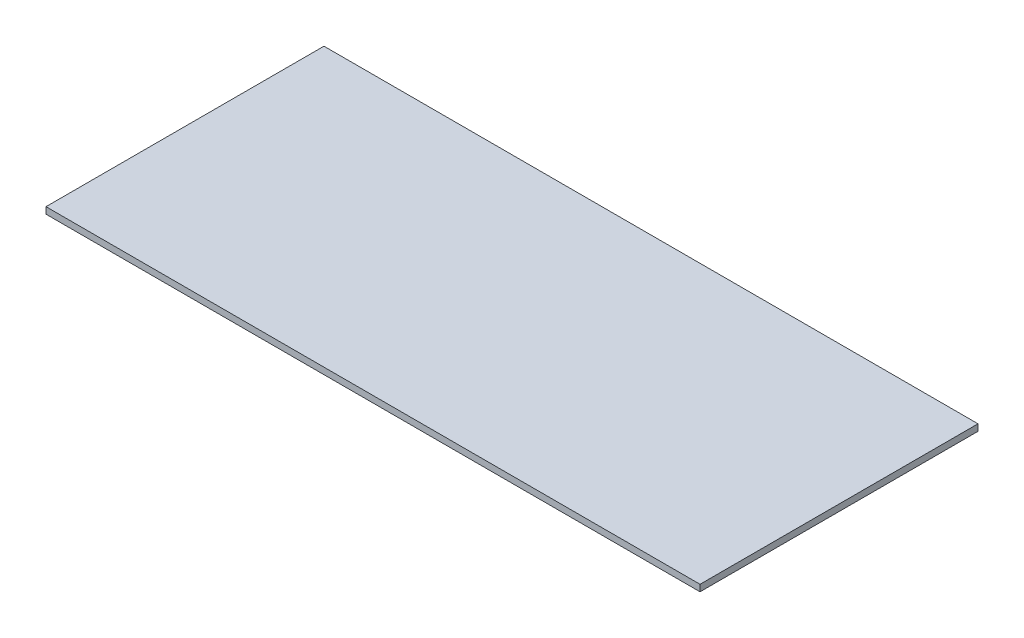
ISO-10303-21;
HEADER;
FILE_DESCRIPTION(('STEP AP214'),'2;1');
FILE_NAME('part.step','',(''),(''),'','','');
FILE_SCHEMA(('AUTOMOTIVE_DESIGN { 1 0 10303 214 1 1 1 1 }'));
ENDSEC;
DATA;
#1=APPLICATION_CONTEXT('core data for automotive mechanical design processes');
#2=APPLICATION_PROTOCOL_DEFINITION('international standard','automotive_design',2000,#1);
#3=PRODUCT_CONTEXT('',#1,'mechanical');
#4=PRODUCT('Part','Part','',(#3));
#5=PRODUCT_RELATED_PRODUCT_CATEGORY('part','',(#4));
#6=PRODUCT_DEFINITION_FORMATION('','',#4);
#7=PRODUCT_DEFINITION_CONTEXT('part definition',#1,'design');
#8=PRODUCT_DEFINITION('design','',#6,#7);
#9=PRODUCT_DEFINITION_SHAPE('','',#8);
#10=(LENGTH_UNIT() NAMED_UNIT(*) SI_UNIT(.MILLI.,.METRE.));
#11=(NAMED_UNIT(*) PLANE_ANGLE_UNIT() SI_UNIT($,.RADIAN.));
#12=(NAMED_UNIT(*) SI_UNIT($,.STERADIAN.) SOLID_ANGLE_UNIT());
#13=UNCERTAINTY_MEASURE_WITH_UNIT(LENGTH_MEASURE(1.E-05),#10,'distance_accuracy_value','');
#14=(GEOMETRIC_REPRESENTATION_CONTEXT(3) GLOBAL_UNCERTAINTY_ASSIGNED_CONTEXT((#13)) GLOBAL_UNIT_ASSIGNED_CONTEXT((#10,
#11,#12)) REPRESENTATION_CONTEXT('',''));
#15=CARTESIAN_POINT('',(0.,0.,0.));
#16=DIRECTION('',(0.,0.,1.));
#17=DIRECTION('',(1.,0.,0.));
#18=AXIS2_PLACEMENT_3D('',#15,#16,#17);
#19=CARTESIAN_POINT('',(100.,23.,430.));
#20=DIRECTION('',(1.,0.,0.));
#21=DIRECTION('',(0.,0.,-1.));
#22=AXIS2_PLACEMENT_3D('',#19,#20,#21);
#23=PLANE('',#22);
#24=DIRECTION('',(0.,0.,1.));
#25=VECTOR('',#24,1.);
#26=CARTESIAN_POINT('',(100.,19.,430.));
#27=LINE('',#26,#25);
#28=CARTESIAN_POINT('',(100.,19.,260.));
#29=VERTEX_POINT('',#28);
#30=CARTESIAN_POINT('',(100.,19.,430.));
#31=VERTEX_POINT('',#30);
#32=EDGE_CURVE('E104',#29,#31,#27,.T.);
#33=ORIENTED_EDGE('',*,*,#32,.T.);
#34=DIRECTION('',(0.,-1.,0.));
#35=VECTOR('',#34,1.);
#36=CARTESIAN_POINT('',(100.,23.,430.));
#37=LINE('',#36,#35);
#38=CARTESIAN_POINT('',(100.,23.,430.));
#39=VERTEX_POINT('',#38);
#40=EDGE_CURVE('E11',#39,#31,#37,.T.);
#41=ORIENTED_EDGE('',*,*,#40,.F.);
#42=DIRECTION('',(0.,0.,1.));
#43=VECTOR('',#42,1.);
#44=CARTESIAN_POINT('',(100.,23.,430.));
#45=LINE('',#44,#43);
#46=CARTESIAN_POINT('',(100.,23.,260.));
#47=VERTEX_POINT('',#46);
#48=EDGE_CURVE('E92',#47,#39,#45,.T.);
#49=ORIENTED_EDGE('',*,*,#48,.F.);
#50=DIRECTION('',(0.,-1.,0.));
#51=VECTOR('',#50,1.);
#52=CARTESIAN_POINT('',(100.,23.,260.));
#53=LINE('',#52,#51);
#54=EDGE_CURVE('E100',#47,#29,#53,.T.);
#55=ORIENTED_EDGE('',*,*,#54,.T.);
#56=EDGE_LOOP('',(#33,#41,#49,#55));
#57=FACE_BOUND('',#56,.T.);
#58=ADVANCED_FACE('F41',(#57),#23,.F.);
#59=CARTESIAN_POINT('',(500.,23.,430.));
#60=DIRECTION('',(0.,0.,-1.));
#61=DIRECTION('',(-1.,0.,0.));
#62=AXIS2_PLACEMENT_3D('',#59,#60,#61);
#63=PLANE('',#62);
#64=DIRECTION('',(1.,0.,0.));
#65=VECTOR('',#64,1.);
#66=CARTESIAN_POINT('',(500.,19.,430.));
#67=LINE('',#66,#65);
#68=CARTESIAN_POINT('',(500.,19.,430.));
#69=VERTEX_POINT('',#68);
#70=EDGE_CURVE('E96',#31,#69,#67,.T.);
#71=ORIENTED_EDGE('',*,*,#70,.T.);
#72=DIRECTION('',(0.,-1.,0.));
#73=VECTOR('',#72,1.);
#74=CARTESIAN_POINT('',(500.,23.,430.));
#75=LINE('',#74,#73);
#76=CARTESIAN_POINT('',(500.,23.,430.));
#77=VERTEX_POINT('',#76);
#78=EDGE_CURVE('E49',#77,#69,#75,.T.);
#79=ORIENTED_EDGE('',*,*,#78,.F.);
#80=DIRECTION('',(1.,0.,0.));
#81=VECTOR('',#80,1.);
#82=CARTESIAN_POINT('',(500.,23.,430.));
#83=LINE('',#82,#81);
#84=EDGE_CURVE('E87',#39,#77,#83,.T.);
#85=ORIENTED_EDGE('',*,*,#84,.F.);
#86=ORIENTED_EDGE('',*,*,#40,.T.);
#87=EDGE_LOOP('',(#71,#79,#85,#86));
#88=FACE_BOUND('',#87,.T.);
#89=ADVANCED_FACE('F95',(#88),#63,.F.);
#90=CARTESIAN_POINT('',(500.,23.,260.));
#91=DIRECTION('',(-1.,0.,0.));
#92=DIRECTION('',(0.,0.,1.));
#93=AXIS2_PLACEMENT_3D('',#90,#91,#92);
#94=PLANE('',#93);
#95=DIRECTION('',(0.,0.,-1.));
#96=VECTOR('',#95,1.);
#97=CARTESIAN_POINT('',(500.,19.,260.));
#98=LINE('',#97,#96);
#99=CARTESIAN_POINT('',(500.,19.,260.));
#100=VERTEX_POINT('',#99);
#101=EDGE_CURVE('E74',#69,#100,#98,.T.);
#102=ORIENTED_EDGE('',*,*,#101,.T.);
#103=DIRECTION('',(0.,-1.,0.));
#104=VECTOR('',#103,1.);
#105=CARTESIAN_POINT('',(500.,23.,260.));
#106=LINE('',#105,#104);
#107=CARTESIAN_POINT('',(500.,23.,260.));
#108=VERTEX_POINT('',#107);
#109=EDGE_CURVE('E97',#108,#100,#106,.T.);
#110=ORIENTED_EDGE('',*,*,#109,.F.);
#111=DIRECTION('',(0.,0.,-1.));
#112=VECTOR('',#111,1.);
#113=CARTESIAN_POINT('',(500.,23.,260.));
#114=LINE('',#113,#112);
#115=EDGE_CURVE('E90',#77,#108,#114,.T.);
#116=ORIENTED_EDGE('',*,*,#115,.F.);
#117=ORIENTED_EDGE('',*,*,#78,.T.);
#118=EDGE_LOOP('',(#102,#110,#116,#117));
#119=FACE_BOUND('',#118,.T.);
#120=ADVANCED_FACE('F98',(#119),#94,.F.);
#121=CARTESIAN_POINT('',(100.,23.,260.));
#122=DIRECTION('',(0.,0.,1.));
#123=DIRECTION('',(1.,0.,0.));
#124=AXIS2_PLACEMENT_3D('',#121,#122,#123);
#125=PLANE('',#124);
#126=DIRECTION('',(-1.,0.,0.));
#127=VECTOR('',#126,1.);
#128=CARTESIAN_POINT('',(100.,19.,260.));
#129=LINE('',#128,#127);
#130=EDGE_CURVE('E80',#100,#29,#129,.T.);
#131=ORIENTED_EDGE('',*,*,#130,.T.);
#132=ORIENTED_EDGE('',*,*,#54,.F.);
#133=DIRECTION('',(-1.,0.,0.));
#134=VECTOR('',#133,1.);
#135=CARTESIAN_POINT('',(100.,23.,260.));
#136=LINE('',#135,#134);
#137=EDGE_CURVE('E57',#108,#47,#136,.T.);
#138=ORIENTED_EDGE('',*,*,#137,.F.);
#139=ORIENTED_EDGE('',*,*,#109,.T.);
#140=EDGE_LOOP('',(#131,#132,#138,#139));
#141=FACE_BOUND('',#140,.T.);
#142=ADVANCED_FACE('F111',(#141),#125,.F.);
#143=CARTESIAN_POINT('',(0.,23.,0.));
#144=DIRECTION('',(0.,-1.,0.));
#145=DIRECTION('',(0.,0.,-1.));
#146=AXIS2_PLACEMENT_3D('',#143,#144,#145);
#147=PLANE('',#146);
#148=ORIENTED_EDGE('',*,*,#48,.T.);
#149=ORIENTED_EDGE('',*,*,#84,.T.);
#150=ORIENTED_EDGE('',*,*,#115,.T.);
#151=ORIENTED_EDGE('',*,*,#137,.T.);
#152=EDGE_LOOP('',(#148,#149,#150,#151));
#153=FACE_BOUND('',#152,.T.);
#154=ADVANCED_FACE('F88',(#153),#147,.F.);
#155=CARTESIAN_POINT('',(0.,19.,0.));
#156=DIRECTION('',(0.,-1.,0.));
#157=DIRECTION('',(0.,0.,-1.));
#158=AXIS2_PLACEMENT_3D('',#155,#156,#157);
#159=PLANE('',#158);
#160=ORIENTED_EDGE('',*,*,#32,.F.);
#161=ORIENTED_EDGE('',*,*,#130,.F.);
#162=ORIENTED_EDGE('',*,*,#101,.F.);
#163=ORIENTED_EDGE('',*,*,#70,.F.);
#164=EDGE_LOOP('',(#160,#161,#162,#163));
#165=FACE_BOUND('',#164,.T.);
#166=ADVANCED_FACE('F114',(#165),#159,.T.);
#167=CLOSED_SHELL('',(#58,#89,#120,#142,#154,#166));
#168=MANIFOLD_SOLID_BREP('B2',#167);
#169=ADVANCED_BREP_SHAPE_REPRESENTATION('',(#18,#168),#14);
#170=SHAPE_DEFINITION_REPRESENTATION(#9,#169);
ENDSEC;
END-ISO-10303-21;
